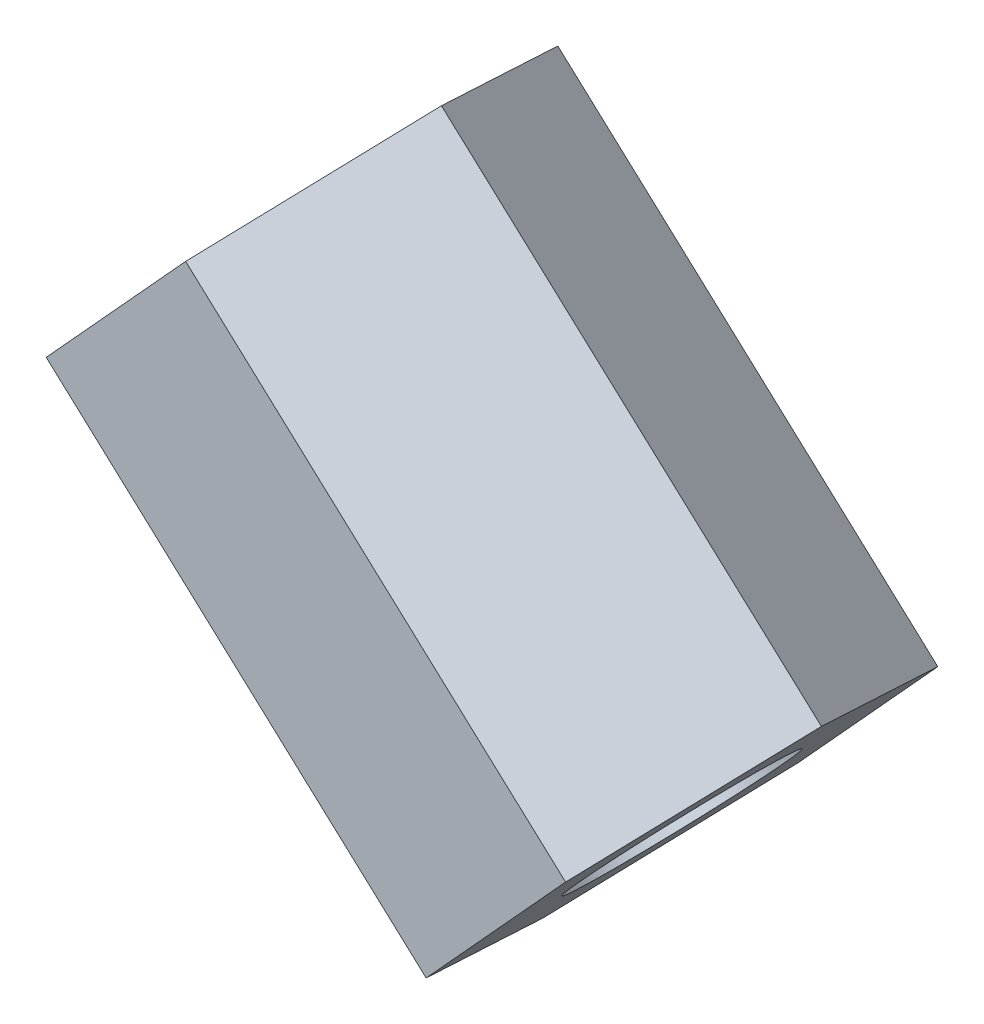
ISO-10303-21;
HEADER;
FILE_DESCRIPTION(('STEP AP214'),'2;1');
FILE_NAME('part.step','',(''),(''),'','','');
FILE_SCHEMA(('AUTOMOTIVE_DESIGN { 1 0 10303 214 1 1 1 1 }'));
ENDSEC;
DATA;
#1=APPLICATION_CONTEXT('core data for automotive mechanical design processes');
#2=APPLICATION_PROTOCOL_DEFINITION('international standard','automotive_design',2000,#1);
#3=PRODUCT_CONTEXT('',#1,'mechanical');
#4=PRODUCT('Part','Part','',(#3));
#5=PRODUCT_RELATED_PRODUCT_CATEGORY('part','',(#4));
#6=PRODUCT_DEFINITION_FORMATION('','',#4);
#7=PRODUCT_DEFINITION_CONTEXT('part definition',#1,'design');
#8=PRODUCT_DEFINITION('design','',#6,#7);
#9=PRODUCT_DEFINITION_SHAPE('','',#8);
#10=(LENGTH_UNIT() NAMED_UNIT(*) SI_UNIT(.MILLI.,.METRE.));
#11=(NAMED_UNIT(*) PLANE_ANGLE_UNIT() SI_UNIT($,.RADIAN.));
#12=(NAMED_UNIT(*) SI_UNIT($,.STERADIAN.) SOLID_ANGLE_UNIT());
#13=UNCERTAINTY_MEASURE_WITH_UNIT(LENGTH_MEASURE(1.E-05),#10,'distance_accuracy_value','');
#14=(GEOMETRIC_REPRESENTATION_CONTEXT(3) GLOBAL_UNCERTAINTY_ASSIGNED_CONTEXT((#13)) GLOBAL_UNIT_ASSIGNED_CONTEXT((#10,
#11,#12)) REPRESENTATION_CONTEXT('',''));
#15=CARTESIAN_POINT('',(0.,0.,0.));
#16=DIRECTION('',(0.,0.,1.));
#17=DIRECTION('',(1.,0.,0.));
#18=AXIS2_PLACEMENT_3D('',#15,#16,#17);
#19=CARTESIAN_POINT('',(25.8924676527032,59.545786848084,30.));
#20=DIRECTION('',(-0.737900796388129,0.674909189958001,0.));
#21=DIRECTION('',(0.,0.,1.));
#22=AXIS2_PLACEMENT_3D('',#19,#20,#21);
#23=PLANE('',#22);
#24=DIRECTION('',(-0.674798407928258,-0.737779674688812,-0.0181179544529441));
#25=VECTOR('',#24,1.);
#26=CARTESIAN_POINT('',(25.9558129165912,59.6150443443011,-11.3833038794098));
#27=LINE('',#26,#25);
#28=CARTESIAN_POINT('',(29.313386131793,63.2859914676956,-11.2931549432672));
#29=VERTEX_POINT('',#28);
#30=CARTESIAN_POINT('',(22.5982397013895,55.9440972209067,-11.4734528155524));
#31=VERTEX_POINT('',#30);
#32=EDGE_CURVE('E96',#29,#31,#27,.T.);
#33=ORIENTED_EDGE('',*,*,#32,.F.);
#34=DIRECTION('',(-0.347988940053363,-0.380467950089132,0.856824274023274));
#35=VECTOR('',#34,1.);
#36=CARTESIAN_POINT('',(31.0448637561946,65.1790738808328,-15.556428535491));
#37=LINE('',#36,#35);
#38=CARTESIAN_POINT('',(32.7763413805962,67.07215629397,-19.8197021277148));
#39=VERTEX_POINT('',#38);
#40=EDGE_CURVE('E26',#39,#29,#37,.T.);
#41=ORIENTED_EDGE('',*,*,#40,.F.);
#42=DIRECTION('',(0.326809467874896,0.35731172459968,0.874942228476218));
#43=VECTOR('',#42,1.);
#44=CARTESIAN_POINT('',(31.1502457897961,65.2942915837128,-24.1731246560812));
#45=LINE('',#44,#43);
#46=CARTESIAN_POINT('',(29.524150198996,63.5164268734555,-28.5265471844476));
#47=VERTEX_POINT('',#46);
#48=EDGE_CURVE('E70',#47,#39,#45,.T.);
#49=ORIENTED_EDGE('',*,*,#48,.F.);
#50=DIRECTION('',(0.674798407928258,0.737779674688812,0.0181179544529441));
#51=VECTOR('',#50,1.);
#52=CARTESIAN_POINT('',(26.1665769837942,59.8454797500611,-28.6166961205902));
#53=LINE('',#52,#51);
#54=CARTESIAN_POINT('',(22.8090037685925,56.1745326266666,-28.7068450567328));
#55=VERTEX_POINT('',#54);
#56=EDGE_CURVE('E143',#55,#47,#53,.T.);
#57=ORIENTED_EDGE('',*,*,#56,.F.);
#58=DIRECTION('',(0.347988940053363,0.380467950089132,-0.856824274023274));
#59=VECTOR('',#58,1.);
#60=CARTESIAN_POINT('',(21.0775261441909,54.2814502135294,-24.443571464509));
#61=LINE('',#60,#59);
#62=CARTESIAN_POINT('',(19.3460485197893,52.3883678003922,-20.1802978722852));
#63=VERTEX_POINT('',#62);
#64=EDGE_CURVE('E108',#63,#55,#61,.T.);
#65=ORIENTED_EDGE('',*,*,#64,.F.);
#66=DIRECTION('',(-0.326809467874896,-0.357311724599679,-0.874942228476218));
#67=VECTOR('',#66,1.);
#68=CARTESIAN_POINT('',(20.9721441105894,54.1662325106494,-15.8268753439188));
#69=LINE('',#68,#67);
#70=EDGE_CURVE('E105',#31,#63,#69,.T.);
#71=ORIENTED_EDGE('',*,*,#70,.F.);
#72=EDGE_LOOP('',(#33,#41,#49,#57,#65,#71));
#73=FACE_BOUND('',#72,.T.);
#74=CARTESIAN_POINT('',(26.0611949501928,59.7302620471811,-20.));
#75=DIRECTION('',(0.737900796388129,-0.674909189958001,0.));
#76=DIRECTION('',(-0.674909189958001,-0.737900796388129,0.));
#77=AXIS2_PLACEMENT_3D('',#74,#75,#76);
#78=CIRCLE('',#77,4.67229161642388);
#79=CARTESIAN_POINT('',(22.9078224001046,56.2825743424643,-20.));
#80=VERTEX_POINT('',#79);
#81=EDGE_CURVE('E11',#80,#80,#78,.T.);
#82=ORIENTED_EDGE('',*,*,#81,.T.);
#83=EDGE_LOOP('',(#82));
#84=FACE_BOUND('',#83,.T.);
#85=ADVANCED_FACE('F16',(#73,#84),#23,.T.);
#86=CARTESIAN_POINT('',(26.0597191486,59.731611865561,-20.));
#87=DIRECTION('',(0.737900796388129,-0.674909189958001,0.));
#88=DIRECTION('',(0.674909189958001,0.737900796388129,0.));
#89=AXIS2_PLACEMENT_3D('',#86,#87,#88);
#90=CYLINDRICAL_SURFACE('',#89,4.67229161642388);
#91=ORIENTED_EDGE('',*,*,#81,.F.);
#92=EDGE_LOOP('',(#91));
#93=FACE_BOUND('',#92,.T.);
#94=CARTESIAN_POINT('',(43.8694732742509,43.4422044152242,-20.));
#95=DIRECTION('',(0.737900796388129,-0.674909189958001,0.));
#96=DIRECTION('',(0.674909189958001,0.737900796388129,0.));
#97=AXIS2_PLACEMENT_3D('',#94,#95,#96);
#98=CIRCLE('',#97,4.67229161642388);
#99=CARTESIAN_POINT('',(47.0228458243391,46.889892119941,-20.));
#100=VERTEX_POINT('',#99);
#101=EDGE_CURVE('E135',#100,#100,#98,.T.);
#102=ORIENTED_EDGE('',*,*,#101,.T.);
#103=EDGE_LOOP('',(#102));
#104=FACE_BOUND('',#103,.T.);
#105=ADVANCED_FACE('F192',(#93,#104),#90,.F.);
#106=CARTESIAN_POINT('',(31.0433879546018,65.1804236992127,-15.556428535491));
#107=DIRECTION('',(0.5782785767174,0.632251314166455,0.515608537016688));
#108=DIRECTION('',(0.665504538025749,0.,-0.746393803475843));
#109=AXIS2_PLACEMENT_3D('',#106,#107,#108);
#110=PLANE('',#109);
#111=DIRECTION('',(0.737900796388129,-0.674909189958001,0.));
#112=VECTOR('',#111,1.);
#113=CARTESIAN_POINT('',(32.7748655790034,67.0735061123499,-19.8197021277148));
#114=LINE('',#113,#112);
#115=CARTESIAN_POINT('',(50.5846197046544,50.7840986620131,-19.8197021277148));
#116=VERTEX_POINT('',#115);
#117=EDGE_CURVE('E19',#39,#116,#114,.T.);
#118=ORIENTED_EDGE('',*,*,#117,.F.);
#119=ORIENTED_EDGE('',*,*,#40,.T.);
#120=DIRECTION('',(0.737900796388129,-0.674909189958001,0.));
#121=VECTOR('',#120,1.);
#122=CARTESIAN_POINT('',(29.3119103302002,63.2873412860755,-11.2931549432672));
#123=LINE('',#122,#121);
#124=CARTESIAN_POINT('',(47.1216644558511,46.9979338357387,-11.2931549432672));
#125=VERTEX_POINT('',#124);
#126=EDGE_CURVE('E51',#29,#125,#123,.T.);
#127=ORIENTED_EDGE('',*,*,#126,.T.);
#128=DIRECTION('',(-0.347988940053363,-0.380467950089132,0.856824274023274));
#129=VECTOR('',#128,1.);
#130=CARTESIAN_POINT('',(48.8531420802527,48.8910162488759,-15.556428535491));
#131=LINE('',#130,#129);
#132=EDGE_CURVE('E161',#116,#125,#131,.T.);
#133=ORIENTED_EDGE('',*,*,#132,.F.);
#134=EDGE_LOOP('',(#118,#119,#127,#133));
#135=FACE_BOUND('',#134,.T.);
#136=ADVANCED_FACE('F172',(#135),#110,.T.);
#137=CARTESIAN_POINT('',(31.1487699882033,65.2956414020927,-24.1731246560812));
#138=DIRECTION('',(0.590506550680932,0.645620567186205,-0.484227319374971));
#139=DIRECTION('',(-0.634088943278889,0.,-0.773260119242847));
#140=AXIS2_PLACEMENT_3D('',#137,#138,#139);
#141=PLANE('',#140);
#142=DIRECTION('',(0.737900796388129,-0.674909189958001,0.));
#143=VECTOR('',#142,1.);
#144=CARTESIAN_POINT('',(29.5226743974032,63.5177766918354,-28.5265471844476));
#145=LINE('',#144,#143);
#146=CARTESIAN_POINT('',(47.3324285230541,47.2283692414987,-28.5265471844476));
#147=VERTEX_POINT('',#146);
#148=EDGE_CURVE('E151',#47,#147,#145,.T.);
#149=ORIENTED_EDGE('',*,*,#148,.F.);
#150=ORIENTED_EDGE('',*,*,#48,.T.);
#151=ORIENTED_EDGE('',*,*,#117,.T.);
#152=DIRECTION('',(0.326809467874896,0.35731172459968,0.874942228476218));
#153=VECTOR('',#152,1.);
#154=CARTESIAN_POINT('',(48.9585241138542,49.0062339517559,-24.1731246560812));
#155=LINE('',#154,#153);
#156=EDGE_CURVE('E63',#147,#116,#155,.T.);
#157=ORIENTED_EDGE('',*,*,#156,.F.);
#158=EDGE_LOOP('',(#149,#150,#151,#157));
#159=FACE_BOUND('',#158,.T.);
#160=ADVANCED_FACE('F171',(#159),#141,.T.);
#161=CARTESIAN_POINT('',(25.9543371149985,59.616394162681,-11.3833038794098));
#162=DIRECTION('',(-0.0122279739635324,-0.0133692530197513,0.999835856391659));
#163=DIRECTION('',(-0.737900796388131,0.674909189957999,0.));
#164=AXIS2_PLACEMENT_3D('',#161,#162,#163);
#165=PLANE('',#164);
#166=ORIENTED_EDGE('',*,*,#126,.F.);
#167=ORIENTED_EDGE('',*,*,#32,.T.);
#168=DIRECTION('',(0.737900796388129,-0.674909189958001,0.));
#169=VECTOR('',#168,1.);
#170=CARTESIAN_POINT('',(22.5967638997967,55.9454470392866,-11.4734528155524));
#171=LINE('',#170,#169);
#172=CARTESIAN_POINT('',(40.4065180254477,39.6560395889498,-11.4734528155524));
#173=VERTEX_POINT('',#172);
#174=EDGE_CURVE('E101',#31,#173,#171,.T.);
#175=ORIENTED_EDGE('',*,*,#174,.T.);
#176=DIRECTION('',(-0.674798407928258,-0.737779674688812,-0.0181179544529441));
#177=VECTOR('',#176,1.);
#178=CARTESIAN_POINT('',(43.7640912406494,43.3269867123443,-11.3833038794098));
#179=LINE('',#178,#177);
#180=EDGE_CURVE('E132',#125,#173,#179,.T.);
#181=ORIENTED_EDGE('',*,*,#180,.F.);
#182=EDGE_LOOP('',(#166,#167,#175,#181));
#183=FACE_BOUND('',#182,.T.);
#184=ADVANCED_FACE('F98',(#183),#165,.T.);
#185=CARTESIAN_POINT('',(43.8694732742509,43.4422044152242,-20.));
#186=DIRECTION('',(0.737900796388129,-0.674909189958001,0.));
#187=DIRECTION('',(0.,0.,-1.));
#188=AXIS2_PLACEMENT_3D('',#185,#186,#187);
#189=PLANE('',#188);
#190=ORIENTED_EDGE('',*,*,#180,.T.);
#191=DIRECTION('',(-0.326809467874896,-0.357311724599679,-0.874942228476218));
#192=VECTOR('',#191,1.);
#193=CARTESIAN_POINT('',(38.7804224346476,37.8781748786925,-15.8268753439188));
#194=LINE('',#193,#192);
#195=CARTESIAN_POINT('',(37.1543268438475,36.1003101684353,-20.1802978722852));
#196=VERTEX_POINT('',#195);
#197=EDGE_CURVE('E118',#173,#196,#194,.T.);
#198=ORIENTED_EDGE('',*,*,#197,.T.);
#199=DIRECTION('',(0.347988940053363,0.380467950089132,-0.856824274023274));
#200=VECTOR('',#199,1.);
#201=CARTESIAN_POINT('',(38.8858044682491,37.9933925815725,-24.443571464509));
#202=LINE('',#201,#200);
#203=CARTESIAN_POINT('',(40.6172820926507,39.8864749947098,-28.7068450567328));
#204=VERTEX_POINT('',#203);
#205=EDGE_CURVE('E139',#196,#204,#202,.T.);
#206=ORIENTED_EDGE('',*,*,#205,.T.);
#207=DIRECTION('',(0.674798407928258,0.737779674688812,0.0181179544529441));
#208=VECTOR('',#207,1.);
#209=CARTESIAN_POINT('',(43.9748553078524,43.5574221181042,-28.6166961205902));
#210=LINE('',#209,#208);
#211=EDGE_CURVE('E147',#204,#147,#210,.T.);
#212=ORIENTED_EDGE('',*,*,#211,.T.);
#213=ORIENTED_EDGE('',*,*,#156,.T.);
#214=ORIENTED_EDGE('',*,*,#132,.T.);
#215=EDGE_LOOP('',(#190,#198,#206,#212,#213,#214));
#216=FACE_BOUND('',#215,.T.);
#217=ORIENTED_EDGE('',*,*,#101,.F.);
#218=EDGE_LOOP('',(#217));
#219=FACE_BOUND('',#218,.T.);
#220=ADVANCED_FACE('F174',(#216,#219),#189,.T.);
#221=CARTESIAN_POINT('',(26.1651011822015,59.846829568441,-28.6166961205902));
#222=DIRECTION('',(0.0122279739635324,0.0133692530197513,-0.999835856391659));
#223=DIRECTION('',(-0.999925222165451,0.,-0.012229066905287));
#224=AXIS2_PLACEMENT_3D('',#221,#222,#223);
#225=PLANE('',#224);
#226=DIRECTION('',(0.737900796388129,-0.674909189958001,0.));
#227=VECTOR('',#226,1.);
#228=CARTESIAN_POINT('',(22.8075279669997,56.1758824450465,-28.7068450567328));
#229=LINE('',#228,#227);
#230=EDGE_CURVE('E129',#55,#204,#229,.T.);
#231=ORIENTED_EDGE('',*,*,#230,.F.);
#232=ORIENTED_EDGE('',*,*,#56,.T.);
#233=ORIENTED_EDGE('',*,*,#148,.T.);
#234=ORIENTED_EDGE('',*,*,#211,.F.);
#235=EDGE_LOOP('',(#231,#232,#233,#234));
#236=FACE_BOUND('',#235,.T.);
#237=ADVANCED_FACE('F178',(#236),#225,.T.);
#238=CARTESIAN_POINT('',(21.0760503425982,54.2828000319093,-24.443571464509));
#239=DIRECTION('',(-0.5782785767174,-0.632251314166454,-0.515608537016688));
#240=DIRECTION('',(-0.737900796388129,0.674909189958001,0.));
#241=AXIS2_PLACEMENT_3D('',#238,#239,#240);
#242=PLANE('',#241);
#243=DIRECTION('',(0.737900796388129,-0.674909189958001,0.));
#244=VECTOR('',#243,1.);
#245=CARTESIAN_POINT('',(19.3445727181966,52.3897176187721,-20.1802978722852));
#246=LINE('',#245,#244);
#247=EDGE_CURVE('E113',#63,#196,#246,.T.);
#248=ORIENTED_EDGE('',*,*,#247,.F.);
#249=ORIENTED_EDGE('',*,*,#64,.T.);
#250=ORIENTED_EDGE('',*,*,#230,.T.);
#251=ORIENTED_EDGE('',*,*,#205,.F.);
#252=EDGE_LOOP('',(#248,#249,#250,#251));
#253=FACE_BOUND('',#252,.T.);
#254=ADVANCED_FACE('F180',(#253),#242,.T.);
#255=CARTESIAN_POINT('',(20.9706683089966,54.1675823290294,-15.8268753439188));
#256=DIRECTION('',(-0.590506550680933,-0.645620567186206,0.48422731937497));
#257=DIRECTION('',(-0.737900796388129,0.674909189958001,0.));
#258=AXIS2_PLACEMENT_3D('',#255,#256,#257);
#259=PLANE('',#258);
#260=ORIENTED_EDGE('',*,*,#174,.F.);
#261=ORIENTED_EDGE('',*,*,#70,.T.);
#262=ORIENTED_EDGE('',*,*,#247,.T.);
#263=ORIENTED_EDGE('',*,*,#197,.F.);
#264=EDGE_LOOP('',(#260,#261,#262,#263));
#265=FACE_BOUND('',#264,.T.);
#266=ADVANCED_FACE('F116',(#265),#259,.T.);
#267=CLOSED_SHELL('',(#85,#105,#136,#160,#184,#220,#237,#254,#266));
#268=MANIFOLD_SOLID_BREP('B1',#267);
#269=ADVANCED_BREP_SHAPE_REPRESENTATION('',(#18,#268),#14);
#270=SHAPE_DEFINITION_REPRESENTATION(#9,#269);
ENDSEC;
END-ISO-10303-21;
